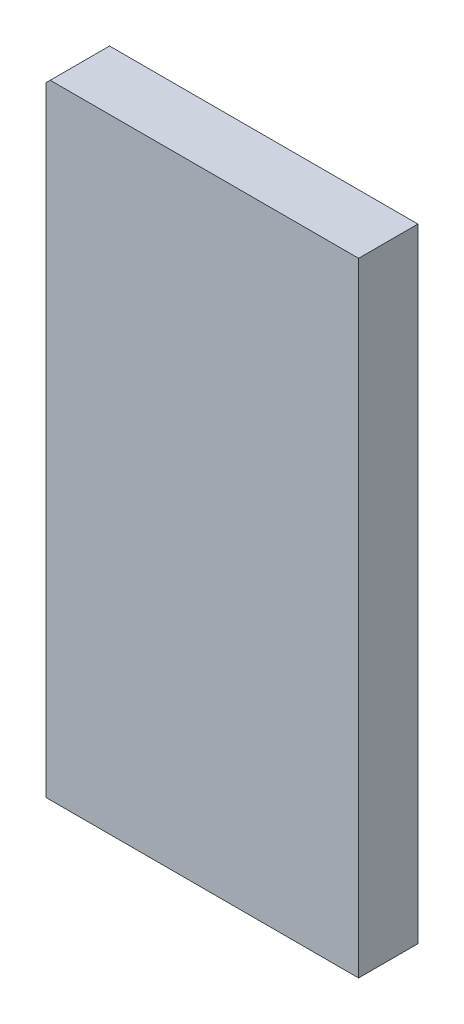
ISO-10303-21;
HEADER;
FILE_DESCRIPTION(('STEP AP214'),'2;1');
FILE_NAME('part.step','',(''),(''),'','','');
FILE_SCHEMA(('AUTOMOTIVE_DESIGN { 1 0 10303 214 1 1 1 1 }'));
ENDSEC;
DATA;
#1=APPLICATION_CONTEXT('core data for automotive mechanical design processes');
#2=APPLICATION_PROTOCOL_DEFINITION('international standard','automotive_design',2000,#1);
#3=PRODUCT_CONTEXT('',#1,'mechanical');
#4=PRODUCT('Part','Part','',(#3));
#5=PRODUCT_RELATED_PRODUCT_CATEGORY('part','',(#4));
#6=PRODUCT_DEFINITION_FORMATION('','',#4);
#7=PRODUCT_DEFINITION_CONTEXT('part definition',#1,'design');
#8=PRODUCT_DEFINITION('design','',#6,#7);
#9=PRODUCT_DEFINITION_SHAPE('','',#8);
#10=(LENGTH_UNIT() NAMED_UNIT(*) SI_UNIT(.MILLI.,.METRE.));
#11=(NAMED_UNIT(*) PLANE_ANGLE_UNIT() SI_UNIT($,.RADIAN.));
#12=(NAMED_UNIT(*) SI_UNIT($,.STERADIAN.) SOLID_ANGLE_UNIT());
#13=UNCERTAINTY_MEASURE_WITH_UNIT(LENGTH_MEASURE(1.E-05),#10,'distance_accuracy_value','');
#14=(GEOMETRIC_REPRESENTATION_CONTEXT(3) GLOBAL_UNCERTAINTY_ASSIGNED_CONTEXT((#13)) GLOBAL_UNIT_ASSIGNED_CONTEXT((#10,
#11,#12)) REPRESENTATION_CONTEXT('',''));
#15=CARTESIAN_POINT('',(0.,0.,0.));
#16=DIRECTION('',(0.,0.,1.));
#17=DIRECTION('',(1.,0.,0.));
#18=AXIS2_PLACEMENT_3D('',#15,#16,#17);
#19=CARTESIAN_POINT('',(-0.4741799,-0.9457563,0.17999964));
#20=DIRECTION('',(0.,0.,1.));
#21=DIRECTION('',(1.,0.,0.));
#22=AXIS2_PLACEMENT_3D('',#19,#20,#21);
#23=PLANE('',#22);
#24=DIRECTION('',(-0.707106781187048,-0.707106781186048,0.));
#25=VECTOR('',#24,1.);
#26=CARTESIAN_POINT('',(-0.4741799,0.9332595,0.17999964));
#27=LINE('',#26,#25);
#28=CARTESIAN_POINT('',(-0.4741799,0.9332595,0.17999964));
#29=VERTEX_POINT('',#28);
#30=CARTESIAN_POINT('',(-0.461683099999998,0.945756299999998,0.17999964));
#31=VERTEX_POINT('',#30);
#32=EDGE_CURVE('E87',#29,#31,#27,.F.);
#33=ORIENTED_EDGE('',*,*,#32,.F.);
#34=DIRECTION('',(0.,1.,0.));
#35=VECTOR('',#34,1.);
#36=CARTESIAN_POINT('',(-0.4741799,-0.9457563,0.17999964));
#37=LINE('',#36,#35);
#38=CARTESIAN_POINT('',(-0.4741799,-0.9457563,0.17999964));
#39=VERTEX_POINT('',#38);
#40=EDGE_CURVE('E76',#39,#29,#37,.T.);
#41=ORIENTED_EDGE('',*,*,#40,.F.);
#42=DIRECTION('',(1.,0.,0.));
#43=VECTOR('',#42,1.);
#44=CARTESIAN_POINT('',(0.4741799,-0.9457563,0.17999964));
#45=LINE('',#44,#43);
#46=CARTESIAN_POINT('',(0.4741799,-0.9457563,0.17999964));
#47=VERTEX_POINT('',#46);
#48=EDGE_CURVE('E20',#47,#39,#45,.F.);
#49=ORIENTED_EDGE('',*,*,#48,.F.);
#50=DIRECTION('',(0.,1.,0.));
#51=VECTOR('',#50,1.);
#52=CARTESIAN_POINT('',(0.4741799,0.9457563,0.17999964));
#53=LINE('',#52,#51);
#54=CARTESIAN_POINT('',(0.4741799,0.9457563,0.17999964));
#55=VERTEX_POINT('',#54);
#56=EDGE_CURVE('E65',#55,#47,#53,.F.);
#57=ORIENTED_EDGE('',*,*,#56,.F.);
#58=DIRECTION('',(1.,0.,0.));
#59=VECTOR('',#58,1.);
#60=CARTESIAN_POINT('',(-0.4616831,0.9457563,0.17999964));
#61=LINE('',#60,#59);
#62=EDGE_CURVE('E60',#31,#55,#61,.T.);
#63=ORIENTED_EDGE('',*,*,#62,.F.);
#64=EDGE_LOOP('',(#33,#41,#49,#57,#63));
#65=FACE_BOUND('',#64,.T.);
#66=ADVANCED_FACE('F17',(#65),#23,.T.);
#67=CARTESIAN_POINT('',(0.4741799,-0.9457563,0.));
#68=DIRECTION('',(0.,-1.,0.));
#69=DIRECTION('',(0.,0.,-1.));
#70=AXIS2_PLACEMENT_3D('',#67,#68,#69);
#71=PLANE('',#70);
#72=DIRECTION('',(0.,0.,1.));
#73=VECTOR('',#72,1.);
#74=CARTESIAN_POINT('',(-0.4741799,-0.9457563,0.));
#75=LINE('',#74,#73);
#76=CARTESIAN_POINT('',(-0.4741799,-0.9457563,0.));
#77=VERTEX_POINT('',#76);
#78=EDGE_CURVE('E91',#77,#39,#75,.T.);
#79=ORIENTED_EDGE('',*,*,#78,.F.);
#80=DIRECTION('',(1.,0.,0.));
#81=VECTOR('',#80,1.);
#82=CARTESIAN_POINT('',(-0.4741799,-0.9457563,0.));
#83=LINE('',#82,#81);
#84=CARTESIAN_POINT('',(0.4741799,-0.9457563,0.));
#85=VERTEX_POINT('',#84);
#86=EDGE_CURVE('E82',#77,#85,#83,.T.);
#87=ORIENTED_EDGE('',*,*,#86,.T.);
#88=DIRECTION('',(0.,0.,-1.));
#89=VECTOR('',#88,1.);
#90=CARTESIAN_POINT('',(0.4741799,-0.9457563,0.));
#91=LINE('',#90,#89);
#92=EDGE_CURVE('E70',#47,#85,#91,.T.);
#93=ORIENTED_EDGE('',*,*,#92,.F.);
#94=ORIENTED_EDGE('',*,*,#48,.T.);
#95=EDGE_LOOP('',(#79,#87,#93,#94));
#96=FACE_BOUND('',#95,.T.);
#97=ADVANCED_FACE('F81',(#96),#71,.T.);
#98=CARTESIAN_POINT('',(0.4741799,0.9457563,0.));
#99=DIRECTION('',(1.,0.,0.));
#100=DIRECTION('',(0.,0.,-1.));
#101=AXIS2_PLACEMENT_3D('',#98,#99,#100);
#102=PLANE('',#101);
#103=ORIENTED_EDGE('',*,*,#92,.T.);
#104=DIRECTION('',(0.,1.,0.));
#105=VECTOR('',#104,1.);
#106=CARTESIAN_POINT('',(0.4741799,-0.9457563,0.));
#107=LINE('',#106,#105);
#108=CARTESIAN_POINT('',(0.4741799,0.9457563,0.));
#109=VERTEX_POINT('',#108);
#110=EDGE_CURVE('E96',#85,#109,#107,.T.);
#111=ORIENTED_EDGE('',*,*,#110,.T.);
#112=DIRECTION('',(0.,0.,1.));
#113=VECTOR('',#112,1.);
#114=CARTESIAN_POINT('',(0.4741799,0.9457563,0.));
#115=LINE('',#114,#113);
#116=EDGE_CURVE('E72',#55,#109,#115,.F.);
#117=ORIENTED_EDGE('',*,*,#116,.F.);
#118=ORIENTED_EDGE('',*,*,#56,.T.);
#119=EDGE_LOOP('',(#103,#111,#117,#118));
#120=FACE_BOUND('',#119,.T.);
#121=ADVANCED_FACE('F67',(#120),#102,.T.);
#122=CARTESIAN_POINT('',(-0.4616831,0.9457563,0.));
#123=DIRECTION('',(0.,1.,0.));
#124=DIRECTION('',(0.,0.,1.));
#125=AXIS2_PLACEMENT_3D('',#122,#123,#124);
#126=PLANE('',#125);
#127=ORIENTED_EDGE('',*,*,#116,.T.);
#128=DIRECTION('',(1.,0.,0.));
#129=VECTOR('',#128,1.);
#130=CARTESIAN_POINT('',(-0.4741799,0.9457563,0.));
#131=LINE('',#130,#129);
#132=CARTESIAN_POINT('',(-0.461683099999998,0.945756299999998,0.));
#133=VERTEX_POINT('',#132);
#134=EDGE_CURVE('E98',#109,#133,#131,.F.);
#135=ORIENTED_EDGE('',*,*,#134,.T.);
#136=DIRECTION('',(0.,0.,1.));
#137=VECTOR('',#136,1.);
#138=CARTESIAN_POINT('',(-0.461683099999991,0.945756299999991,0.));
#139=LINE('',#138,#137);
#140=EDGE_CURVE('E89',#31,#133,#139,.F.);
#141=ORIENTED_EDGE('',*,*,#140,.F.);
#142=ORIENTED_EDGE('',*,*,#62,.T.);
#143=EDGE_LOOP('',(#127,#135,#141,#142));
#144=FACE_BOUND('',#143,.T.);
#145=ADVANCED_FACE('F108',(#144),#126,.T.);
#146=CARTESIAN_POINT('',(-0.4741799,0.9332595,0.));
#147=DIRECTION('',(-0.707106781186048,0.707106781187048,0.));
#148=DIRECTION('',(-0.707106781187048,-0.707106781186048,0.));
#149=AXIS2_PLACEMENT_3D('',#146,#147,#148);
#150=PLANE('',#149);
#151=ORIENTED_EDGE('',*,*,#140,.T.);
#152=DIRECTION('',(-0.707106781186549,-0.707106781186546,0.));
#153=VECTOR('',#152,1.);
#154=CARTESIAN_POINT('',(-0.4616831,0.9457563,0.));
#155=LINE('',#154,#153);
#156=CARTESIAN_POINT('',(-0.4741799,0.9332595,0.));
#157=VERTEX_POINT('',#156);
#158=EDGE_CURVE('E26',#133,#157,#155,.T.);
#159=ORIENTED_EDGE('',*,*,#158,.T.);
#160=DIRECTION('',(0.,0.,1.));
#161=VECTOR('',#160,1.);
#162=CARTESIAN_POINT('',(-0.4741799,0.9332595,0.));
#163=LINE('',#162,#161);
#164=EDGE_CURVE('E34',#29,#157,#163,.F.);
#165=ORIENTED_EDGE('',*,*,#164,.F.);
#166=ORIENTED_EDGE('',*,*,#32,.T.);
#167=EDGE_LOOP('',(#151,#159,#165,#166));
#168=FACE_BOUND('',#167,.T.);
#169=ADVANCED_FACE('F104',(#168),#150,.T.);
#170=CARTESIAN_POINT('',(-0.4741799,-0.9457563,0.));
#171=DIRECTION('',(-1.,0.,0.));
#172=DIRECTION('',(0.,0.,1.));
#173=AXIS2_PLACEMENT_3D('',#170,#171,#172);
#174=PLANE('',#173);
#175=ORIENTED_EDGE('',*,*,#164,.T.);
#176=DIRECTION('',(0.,1.,0.));
#177=VECTOR('',#176,1.);
#178=CARTESIAN_POINT('',(-0.4741799,-0.9457563,0.));
#179=LINE('',#178,#177);
#180=EDGE_CURVE('E11',#157,#77,#179,.F.);
#181=ORIENTED_EDGE('',*,*,#180,.T.);
#182=ORIENTED_EDGE('',*,*,#78,.T.);
#183=ORIENTED_EDGE('',*,*,#40,.T.);
#184=EDGE_LOOP('',(#175,#181,#182,#183));
#185=FACE_BOUND('',#184,.T.);
#186=ADVANCED_FACE('F116',(#185),#174,.T.);
#187=CARTESIAN_POINT('',(-0.4741799,-0.9457563,0.));
#188=DIRECTION('',(0.,0.,1.));
#189=DIRECTION('',(1.,0.,0.));
#190=AXIS2_PLACEMENT_3D('',#187,#188,#189);
#191=PLANE('',#190);
#192=ORIENTED_EDGE('',*,*,#158,.F.);
#193=ORIENTED_EDGE('',*,*,#134,.F.);
#194=ORIENTED_EDGE('',*,*,#110,.F.);
#195=ORIENTED_EDGE('',*,*,#86,.F.);
#196=ORIENTED_EDGE('',*,*,#180,.F.);
#197=EDGE_LOOP('',(#192,#193,#194,#195,#196));
#198=FACE_BOUND('',#197,.T.);
#199=ADVANCED_FACE('F107',(#198),#191,.F.);
#200=CLOSED_SHELL('',(#66,#97,#121,#145,#169,#186,#199));
#201=MANIFOLD_SOLID_BREP('B1',#200);
#202=ADVANCED_BREP_SHAPE_REPRESENTATION('',(#18,#201),#14);
#203=SHAPE_DEFINITION_REPRESENTATION(#9,#202);
ENDSEC;
END-ISO-10303-21;
